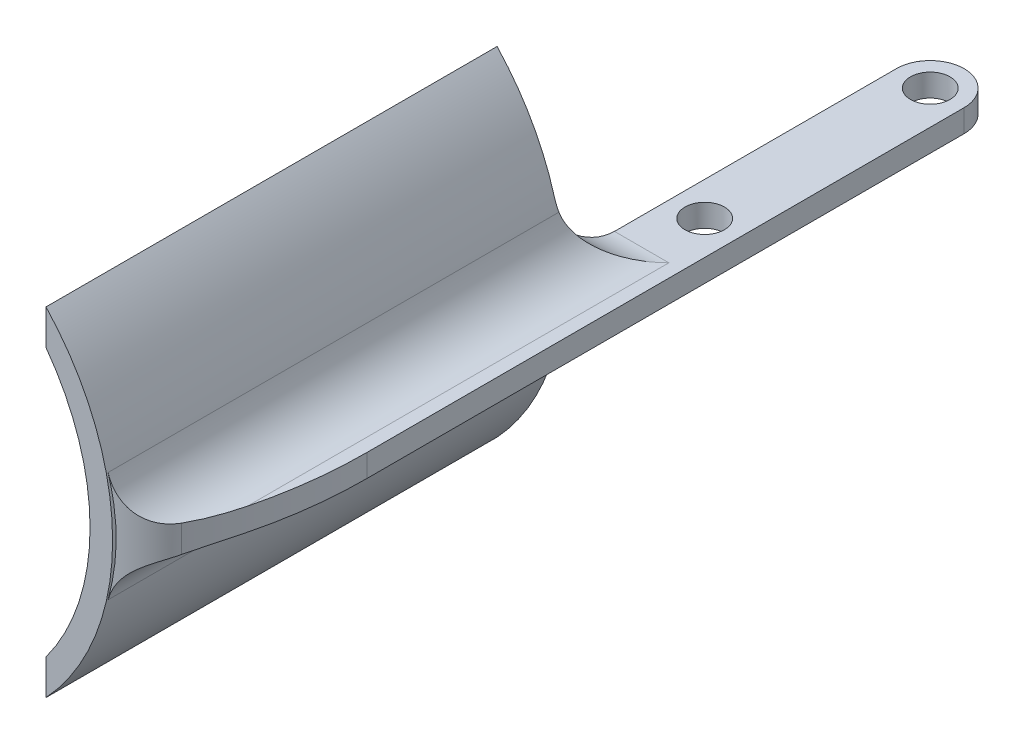
ISO-10303-21;
HEADER;
FILE_DESCRIPTION(('STEP AP214'),'2;1');
FILE_NAME('part.step','',(''),(''),'','','');
FILE_SCHEMA(('AUTOMOTIVE_DESIGN { 1 0 10303 214 1 1 1 1 }'));
ENDSEC;
DATA;
#1=APPLICATION_CONTEXT('core data for automotive mechanical design processes');
#2=APPLICATION_PROTOCOL_DEFINITION('international standard','automotive_design',2000,#1);
#3=PRODUCT_CONTEXT('',#1,'mechanical');
#4=PRODUCT('Part','Part','',(#3));
#5=PRODUCT_RELATED_PRODUCT_CATEGORY('part','',(#4));
#6=PRODUCT_DEFINITION_FORMATION('','',#4);
#7=PRODUCT_DEFINITION_CONTEXT('part definition',#1,'design');
#8=PRODUCT_DEFINITION('design','',#6,#7);
#9=PRODUCT_DEFINITION_SHAPE('','',#8);
#10=(LENGTH_UNIT() NAMED_UNIT(*) SI_UNIT(.MILLI.,.METRE.));
#11=(NAMED_UNIT(*) PLANE_ANGLE_UNIT() SI_UNIT($,.RADIAN.));
#12=(NAMED_UNIT(*) SI_UNIT($,.STERADIAN.) SOLID_ANGLE_UNIT());
#13=UNCERTAINTY_MEASURE_WITH_UNIT(LENGTH_MEASURE(1.E-05),#10,'distance_accuracy_value','');
#14=(GEOMETRIC_REPRESENTATION_CONTEXT(3) GLOBAL_UNCERTAINTY_ASSIGNED_CONTEXT((#13)) GLOBAL_UNIT_ASSIGNED_CONTEXT((#10,
#11,#12)) REPRESENTATION_CONTEXT('',''));
#15=CARTESIAN_POINT('',(0.,0.,0.));
#16=DIRECTION('',(0.,0.,1.));
#17=DIRECTION('',(1.,0.,0.));
#18=AXIS2_PLACEMENT_3D('',#15,#16,#17);
#19=CARTESIAN_POINT('',(-30.8214285714286,2.,-17.0461558297297));
#20=DIRECTION('',(0.,-1.,0.));
#21=DIRECTION('',(0.,0.,-1.));
#22=AXIS2_PLACEMENT_3D('',#19,#20,#21);
#23=CYLINDRICAL_SURFACE('',#22,38.3214285714286);
#24=CARTESIAN_POINT('',(-30.8214285714286,2.,-17.0461558297297));
#25=DIRECTION('',(0.,1.,0.));
#26=DIRECTION('',(0.,0.,-1.));
#27=AXIS2_PLACEMENT_3D('',#24,#25,#26);
#28=CIRCLE('',#27,38.3214285714286);
#29=CARTESIAN_POINT('',(6.32489316217637,2.,-7.62900820326596));
#30=VERTEX_POINT('',#29);
#31=CARTESIAN_POINT('',(7.5,2.,-17.0461558297297));
#32=VERTEX_POINT('',#31);
#33=EDGE_CURVE('E209',#30,#32,#28,.T.);
#34=ORIENTED_EDGE('',*,*,#33,.F.);
#35=CARTESIAN_POINT('',(6.32489316217636,2.,-7.62900820326596));
#36=CARTESIAN_POINT('',(6.27707327635392,2.00000235625704,-7.44038034578845));
#37=CARTESIAN_POINT('',(6.2278169274933,2.00068571798965,-7.25211890833999));
#38=CARTESIAN_POINT('',(6.12644428756139,2.00368199035217,-6.87637483605984));
#39=CARTESIAN_POINT('',(6.07432790904078,2.00599495083492,-6.6888922252306));
#40=CARTESIAN_POINT('',(5.91389117146253,2.01576864076235,-6.12832234970799));
#41=CARTESIAN_POINT('',(5.80132370903215,2.02606241366789,-5.75648398435544));
#42=CARTESIAN_POINT('',(5.56504093643033,2.05663811454083,-5.01671352206102));
#43=CARTESIAN_POINT('',(5.44132466233196,2.07692090683769,-4.64878176596497));
#44=CARTESIAN_POINT('',(5.24754639616546,2.11700137547345,-4.10016642924162));
#45=CARTESIAN_POINT('',(5.18152865325315,2.13198722007853,-3.91769298583726));
#46=CARTESIAN_POINT('',(5.04683840026124,2.16560438238466,-3.55404986794203));
#47=CARTESIAN_POINT('',(4.97816566186703,2.18423601416485,-3.37288030717383));
#48=CARTESIAN_POINT('',(4.90819776168529,2.20490102894346,-3.19243106520669));
#49=B_SPLINE_CURVE_WITH_KNOTS('',3,(#35,#36,#37,#38,#39,#40,#41,#42,#43,#44,#45,#46,#47,#48),
.UNSPECIFIED.,.F.,.F.,(4,2,2,2,2,2,4),(0.,0.583772582110879,1.16756302382368,2.33319812881794,
3.49893411156505,4.08276319124045,4.66664258908381),.UNSPECIFIED.);
#50=CARTESIAN_POINT('',(4.9081977616853,2.20490102894346,-3.19243106520669));
#51=VERTEX_POINT('',#50);
#52=EDGE_CURVE('E300',#30,#51,#49,.T.);
#53=ORIENTED_EDGE('',*,*,#52,.T.);
#54=DIRECTION('',(0.,-1.,0.));
#55=VECTOR('',#54,1.);
#56=CARTESIAN_POINT('',(4.9081977616853,2.,-3.19243106520669));
#57=LINE('',#56,#55);
#58=CARTESIAN_POINT('',(4.9081977616853,-0.20490102894346,-3.19243106520669));
#59=VERTEX_POINT('',#58);
#60=EDGE_CURVE('E246',#51,#59,#57,.T.);
#61=ORIENTED_EDGE('',*,*,#60,.T.);
#62=CARTESIAN_POINT('',(4.9081977616853,-0.20490102894346,-3.19243106520669));
#63=CARTESIAN_POINT('',(4.97816566186703,-0.184236014164849,-3.37288030717383));
#64=CARTESIAN_POINT('',(5.04683840026124,-0.165604382384656,-3.55404986794203));
#65=CARTESIAN_POINT('',(5.18152865325315,-0.131987220078529,-3.91769298583726));
#66=CARTESIAN_POINT('',(5.24754639616546,-0.11700137547345,-4.10016642924162));
#67=CARTESIAN_POINT('',(5.44132466233196,-0.0769209068376889,-4.64878176596497));
#68=CARTESIAN_POINT('',(5.56504093643033,-0.0566381145408316,-5.01671352206102));
#69=CARTESIAN_POINT('',(5.80132370903214,-0.0260624136678938,-5.75648398435544));
#70=CARTESIAN_POINT('',(5.91389117146254,-0.0157686407623454,-6.12832234970799));
#71=CARTESIAN_POINT('',(6.07432790904078,-0.0059949508349247,-6.6888922252306));
#72=CARTESIAN_POINT('',(6.1264442875614,-0.00368199035217468,-6.87637483605984));
#73=CARTESIAN_POINT('',(6.2278169274933,-0.000685717989651057,-7.25211890833999));
#74=CARTESIAN_POINT('',(6.27707327635392,-2.35625703727614E-06,-7.44038034578845));
#75=CARTESIAN_POINT('',(6.32489316217637,0.,-7.62900820326596));
#76=B_SPLINE_CURVE_WITH_KNOTS('',3,(#62,#63,#64,#65,#66,#67,#68,#69,#70,#71,#72,#73,#74,#75),
.UNSPECIFIED.,.F.,.F.,(4,2,2,2,2,2,4),(0.,0.58387939784336,1.16770847751876,2.33344446026587,
3.49907956526013,4.08287000697293,4.66664258908381),.UNSPECIFIED.);
#77=CARTESIAN_POINT('',(6.32489316217637,0.,-7.62900820326596));
#78=VERTEX_POINT('',#77);
#79=EDGE_CURVE('E375',#59,#78,#76,.T.);
#80=ORIENTED_EDGE('',*,*,#79,.T.);
#81=CARTESIAN_POINT('',(-30.8214285714286,0.,-17.0461558297297));
#82=DIRECTION('',(0.,1.,0.));
#83=DIRECTION('',(0.,0.,-1.));
#84=AXIS2_PLACEMENT_3D('',#81,#82,#83);
#85=CIRCLE('',#84,38.3214285714286);
#86=CARTESIAN_POINT('',(7.5,0.,-17.0461558297297));
#87=VERTEX_POINT('',#86);
#88=EDGE_CURVE('E208',#78,#87,#85,.T.);
#89=ORIENTED_EDGE('',*,*,#88,.T.);
#90=DIRECTION('',(0.,-1.,0.));
#91=VECTOR('',#90,1.);
#92=CARTESIAN_POINT('',(7.5,2.,-17.0461558297297));
#93=LINE('',#92,#91);
#94=EDGE_CURVE('E236',#32,#87,#93,.T.);
#95=ORIENTED_EDGE('',*,*,#94,.F.);
#96=EDGE_LOOP('',(#34,#53,#61,#80,#89,#95));
#97=FACE_BOUND('',#96,.T.);
#98=ADVANCED_FACE('F34',(#97),#23,.T.);
#99=CARTESIAN_POINT('',(7.49999999999999,2.,-70.));
#100=DIRECTION('',(-1.,0.,0.));
#101=DIRECTION('',(0.,0.,1.));
#102=AXIS2_PLACEMENT_3D('',#99,#100,#101);
#103=PLANE('',#102);
#104=DIRECTION('',(0.,0.,-1.));
#105=VECTOR('',#104,1.);
#106=CARTESIAN_POINT('',(7.49999999999999,0.,-70.));
#107=LINE('',#106,#105);
#108=CARTESIAN_POINT('',(7.49999999999999,0.,-70.));
#109=VERTEX_POINT('',#108);
#110=EDGE_CURVE('E221',#87,#109,#107,.T.);
#111=ORIENTED_EDGE('',*,*,#110,.T.);
#112=DIRECTION('',(0.,-1.,0.));
#113=VECTOR('',#112,1.);
#114=CARTESIAN_POINT('',(7.49999999999999,2.,-70.));
#115=LINE('',#114,#113);
#116=CARTESIAN_POINT('',(7.49999999999999,2.,-70.));
#117=VERTEX_POINT('',#116);
#118=EDGE_CURVE('E233',#117,#109,#115,.T.);
#119=ORIENTED_EDGE('',*,*,#118,.F.);
#120=DIRECTION('',(0.,0.,-1.));
#121=VECTOR('',#120,1.);
#122=CARTESIAN_POINT('',(7.49999999999999,2.,-70.));
#123=LINE('',#122,#121);
#124=EDGE_CURVE('E211',#32,#117,#123,.T.);
#125=ORIENTED_EDGE('',*,*,#124,.F.);
#126=ORIENTED_EDGE('',*,*,#94,.T.);
#127=EDGE_LOOP('',(#111,#119,#125,#126));
#128=FACE_BOUND('',#127,.T.);
#129=ADVANCED_FACE('F371',(#128),#103,.F.);
#130=CARTESIAN_POINT('',(4.49999999999999,2.,-70.));
#131=DIRECTION('',(0.,-1.,0.));
#132=DIRECTION('',(0.,0.,-1.));
#133=AXIS2_PLACEMENT_3D('',#130,#131,#132);
#134=CYLINDRICAL_SURFACE('',#133,3.);
#135=CARTESIAN_POINT('',(4.49999999999999,0.,-70.));
#136=DIRECTION('',(0.,1.,0.));
#137=DIRECTION('',(0.,0.,-1.));
#138=AXIS2_PLACEMENT_3D('',#135,#136,#137);
#139=CIRCLE('',#138,3.);
#140=CARTESIAN_POINT('',(1.49999999999999,0.,-70.));
#141=VERTEX_POINT('',#140);
#142=EDGE_CURVE('E223',#109,#141,#139,.T.);
#143=ORIENTED_EDGE('',*,*,#142,.T.);
#144=DIRECTION('',(0.,-1.,0.));
#145=VECTOR('',#144,1.);
#146=CARTESIAN_POINT('',(1.49999999999999,2.,-70.));
#147=LINE('',#146,#145);
#148=CARTESIAN_POINT('',(1.49999999999999,2.,-70.));
#149=VERTEX_POINT('',#148);
#150=EDGE_CURVE('E230',#149,#141,#147,.T.);
#151=ORIENTED_EDGE('',*,*,#150,.F.);
#152=CARTESIAN_POINT('',(4.49999999999999,2.,-70.));
#153=DIRECTION('',(0.,1.,0.));
#154=DIRECTION('',(0.,0.,-1.));
#155=AXIS2_PLACEMENT_3D('',#152,#153,#154);
#156=CIRCLE('',#155,3.);
#157=EDGE_CURVE('E214',#117,#149,#156,.T.);
#158=ORIENTED_EDGE('',*,*,#157,.F.);
#159=ORIENTED_EDGE('',*,*,#118,.T.);
#160=EDGE_LOOP('',(#143,#151,#158,#159));
#161=FACE_BOUND('',#160,.T.);
#162=ADVANCED_FACE('F407',(#161),#134,.T.);
#163=CARTESIAN_POINT('',(1.49999999999999,2.,-40.));
#164=DIRECTION('',(1.,0.,0.));
#165=DIRECTION('',(0.,0.,-1.));
#166=AXIS2_PLACEMENT_3D('',#163,#164,#165);
#167=PLANE('',#166);
#168=DIRECTION('',(0.,0.,1.));
#169=VECTOR('',#168,1.);
#170=CARTESIAN_POINT('',(1.49999999999999,0.,-40.));
#171=LINE('',#170,#169);
#172=CARTESIAN_POINT('',(1.49999999999999,0.,-45.2678268764264));
#173=VERTEX_POINT('',#172);
#174=EDGE_CURVE('E212',#141,#173,#171,.T.);
#175=ORIENTED_EDGE('',*,*,#174,.T.);
#176=DIRECTION('',(0.,1.,0.));
#177=VECTOR('',#176,1.);
#178=CARTESIAN_POINT('',(1.49999999999999,2.,-45.2678268764264));
#179=LINE('',#178,#177);
#180=CARTESIAN_POINT('',(1.49999999999999,2.,-45.2678268764264));
#181=VERTEX_POINT('',#180);
#182=EDGE_CURVE('E239',#173,#181,#179,.T.);
#183=ORIENTED_EDGE('',*,*,#182,.T.);
#184=DIRECTION('',(0.,0.,1.));
#185=VECTOR('',#184,1.);
#186=CARTESIAN_POINT('',(1.49999999999999,2.,-40.));
#187=LINE('',#186,#185);
#188=EDGE_CURVE('E216',#149,#181,#187,.T.);
#189=ORIENTED_EDGE('',*,*,#188,.F.);
#190=ORIENTED_EDGE('',*,*,#150,.T.);
#191=EDGE_LOOP('',(#175,#183,#189,#190));
#192=FACE_BOUND('',#191,.T.);
#193=ADVANCED_FACE('F411',(#192),#167,.F.);
#194=CARTESIAN_POINT('',(4.49999999999999,2.,-70.));
#195=DIRECTION('',(0.,-1.,0.));
#196=DIRECTION('',(0.,0.,-1.));
#197=AXIS2_PLACEMENT_3D('',#194,#195,#196);
#198=PLANE('',#197);
#199=CARTESIAN_POINT('',(4.49999999999999,2.,-70.));
#200=DIRECTION('',(0.,-1.,0.));
#201=DIRECTION('',(0.,0.,-1.));
#202=AXIS2_PLACEMENT_3D('',#199,#200,#201);
#203=CIRCLE('',#202,1.75);
#204=CARTESIAN_POINT('',(4.49999999999999,2.,-71.75));
#205=VERTEX_POINT('',#204);
#206=EDGE_CURVE('E205',#205,#205,#203,.T.);
#207=ORIENTED_EDGE('',*,*,#206,.T.);
#208=EDGE_LOOP('',(#207));
#209=FACE_BOUND('',#208,.T.);
#210=CARTESIAN_POINT('',(4.5,2.,-50.));
#211=DIRECTION('',(0.,-1.,0.));
#212=DIRECTION('',(0.,0.,-1.));
#213=AXIS2_PLACEMENT_3D('',#210,#211,#212);
#214=CIRCLE('',#213,1.75);
#215=CARTESIAN_POINT('',(4.5,2.,-51.75));
#216=VERTEX_POINT('',#215);
#217=EDGE_CURVE('E200',#216,#216,#214,.T.);
#218=ORIENTED_EDGE('',*,*,#217,.T.);
#219=EDGE_LOOP('',(#218));
#220=FACE_BOUND('',#219,.T.);
#221=CARTESIAN_POINT('',(-8.50000000000001,2.,-45.2678268764264));
#222=DIRECTION('',(0.,-1.,0.));
#223=DIRECTION('',(0.,0.,-1.));
#224=AXIS2_PLACEMENT_3D('',#221,#222,#223);
#225=CIRCLE('',#224,10.);
#226=CARTESIAN_POINT('',(1.49641279481112,2.,-45.));
#227=VERTEX_POINT('',#226);
#228=EDGE_CURVE('E243',#181,#227,#225,.T.);
#229=ORIENTED_EDGE('',*,*,#228,.T.);
#230=DIRECTION('',(-1.,0.,0.));
#231=VECTOR('',#230,1.);
#232=CARTESIAN_POINT('',(6.32489316217636,2.,-45.));
#233=LINE('',#232,#231);
#234=CARTESIAN_POINT('',(6.32489316217636,2.,-45.));
#235=VERTEX_POINT('',#234);
#236=EDGE_CURVE('E322',#227,#235,#233,.F.);
#237=ORIENTED_EDGE('',*,*,#236,.T.);
#238=DIRECTION('',(0.,0.,1.));
#239=VECTOR('',#238,1.);
#240=CARTESIAN_POINT('',(6.32489316217636,2.,-70.));
#241=LINE('',#240,#239);
#242=EDGE_CURVE('E388',#235,#30,#241,.T.);
#243=ORIENTED_EDGE('',*,*,#242,.T.);
#244=ORIENTED_EDGE('',*,*,#33,.T.);
#245=ORIENTED_EDGE('',*,*,#124,.T.);
#246=ORIENTED_EDGE('',*,*,#157,.T.);
#247=ORIENTED_EDGE('',*,*,#188,.T.);
#248=EDGE_LOOP('',(#229,#237,#243,#244,#245,#246,#247));
#249=FACE_BOUND('',#248,.T.);
#250=ADVANCED_FACE('F396',(#209,#220,#249),#198,.F.);
#251=CARTESIAN_POINT('',(4.49999999999999,0.,-70.));
#252=DIRECTION('',(0.,-1.,0.));
#253=DIRECTION('',(0.,0.,-1.));
#254=AXIS2_PLACEMENT_3D('',#251,#252,#253);
#255=PLANE('',#254);
#256=DIRECTION('',(0.,0.,-1.));
#257=VECTOR('',#256,1.);
#258=CARTESIAN_POINT('',(6.32489316217636,0.,-40.));
#259=LINE('',#258,#257);
#260=CARTESIAN_POINT('',(6.32489316217636,0.,-45.));
#261=VERTEX_POINT('',#260);
#262=EDGE_CURVE('E390',#78,#261,#259,.T.);
#263=ORIENTED_EDGE('',*,*,#262,.T.);
#264=DIRECTION('',(-1.,0.,0.));
#265=VECTOR('',#264,1.);
#266=CARTESIAN_POINT('',(4.49999999999999,0.,-45.));
#267=LINE('',#266,#265);
#268=CARTESIAN_POINT('',(1.49641279481112,0.,-45.));
#269=VERTEX_POINT('',#268);
#270=EDGE_CURVE('E315',#261,#269,#267,.T.);
#271=ORIENTED_EDGE('',*,*,#270,.T.);
#272=CARTESIAN_POINT('',(-8.50000000000001,0.,-45.2678268764264));
#273=DIRECTION('',(0.,-1.,0.));
#274=DIRECTION('',(0.,0.,-1.));
#275=AXIS2_PLACEMENT_3D('',#272,#273,#274);
#276=CIRCLE('',#275,10.);
#277=EDGE_CURVE('E241',#269,#173,#276,.F.);
#278=ORIENTED_EDGE('',*,*,#277,.T.);
#279=ORIENTED_EDGE('',*,*,#174,.F.);
#280=ORIENTED_EDGE('',*,*,#142,.F.);
#281=ORIENTED_EDGE('',*,*,#110,.F.);
#282=ORIENTED_EDGE('',*,*,#88,.F.);
#283=EDGE_LOOP('',(#263,#271,#278,#279,#280,#281,#282));
#284=FACE_BOUND('',#283,.T.);
#285=CARTESIAN_POINT('',(4.49999999999999,0.,-70.));
#286=DIRECTION('',(0.,1.,0.));
#287=DIRECTION('',(0.,0.,1.));
#288=AXIS2_PLACEMENT_3D('',#285,#286,#287);
#289=CIRCLE('',#288,1.75);
#290=CARTESIAN_POINT('',(4.49999999999999,0.,-68.25));
#291=VERTEX_POINT('',#290);
#292=EDGE_CURVE('E197',#291,#291,#289,.T.);
#293=ORIENTED_EDGE('',*,*,#292,.T.);
#294=EDGE_LOOP('',(#293));
#295=FACE_BOUND('',#294,.T.);
#296=CARTESIAN_POINT('',(4.5,0.,-50.));
#297=DIRECTION('',(0.,1.,0.));
#298=DIRECTION('',(0.,0.,1.));
#299=AXIS2_PLACEMENT_3D('',#296,#297,#298);
#300=CIRCLE('',#299,1.75);
#301=CARTESIAN_POINT('',(4.5,0.,-48.25));
#302=VERTEX_POINT('',#301);
#303=EDGE_CURVE('E192',#302,#302,#300,.T.);
#304=ORIENTED_EDGE('',*,*,#303,.T.);
#305=EDGE_LOOP('',(#304));
#306=FACE_BOUND('',#305,.T.);
#307=ADVANCED_FACE('F365',(#284,#295,#306),#255,.T.);
#308=CARTESIAN_POINT('',(-8.50000000000001,2.,-45.2678268764264));
#309=DIRECTION('',(0.,1.,0.));
#310=DIRECTION('',(0.,0.,1.));
#311=AXIS2_PLACEMENT_3D('',#308,#309,#310);
#312=CYLINDRICAL_SURFACE('',#311,10.);
#313=ORIENTED_EDGE('',*,*,#228,.F.);
#314=ORIENTED_EDGE('',*,*,#182,.F.);
#315=ORIENTED_EDGE('',*,*,#277,.F.);
#316=CARTESIAN_POINT('',(1.49641279481112,0.,-45.));
#317=CARTESIAN_POINT('',(1.49287519432976,2.2430243795173E-05,-44.8670429848361));
#318=CARTESIAN_POINT('',(1.4866371610133,-0.00530217517071067,-44.7341733567804));
#319=CARTESIAN_POINT('',(1.46897108711546,-0.0264408943517034,-44.4696772682441));
#320=CARTESIAN_POINT('',(1.45754540165065,-0.0422502496971525,-44.3380502712775));
#321=CARTESIAN_POINT('',(1.42977776273164,-0.0840541860501793,-44.0776088139234));
#322=CARTESIAN_POINT('',(1.41345954929194,-0.109999763252416,-43.9487839235138));
#323=CARTESIAN_POINT('',(1.37624525429644,-0.171747383921411,-43.6941922139222));
#324=CARTESIAN_POINT('',(1.35534882010999,-0.207550186680899,-43.5684256311313));
#325=CARTESIAN_POINT('',(1.30946121935236,-0.28855063067089,-43.3209634350871));
#326=CARTESIAN_POINT('',(1.28447691662806,-0.33373255722882,-43.1992614026833));
#327=CARTESIAN_POINT('',(1.23091556998946,-0.43308432923872,-42.9603831962769));
#328=CARTESIAN_POINT('',(1.20233717330987,-0.4872575613565,-42.8432087482142));
#329=CARTESIAN_POINT('',(1.11203207149931,-0.662657100042663,-42.4992715494778));
#330=CARTESIAN_POINT('',(1.04573963847538,-0.796756052729763,-42.280116684918));
#331=CARTESIAN_POINT('',(0.901658000391102,-1.10531617338325,-41.8526982942335));
#332=CARTESIAN_POINT('',(0.82339896090372,-1.28185560680775,-41.6461055912304));
#333=CARTESIAN_POINT('',(0.665866236014294,-1.66582737275344,-41.2641253844953));
#334=CARTESIAN_POINT('',(0.586591707250554,-1.87328714103489,-41.0887659005836));
#335=CARTESIAN_POINT('',(0.428601581965043,-2.33307268835162,-40.7605190518467));
#336=CARTESIAN_POINT('',(0.350413615013548,-2.58763749598878,-40.6104580531392));
#337=CARTESIAN_POINT('',(0.246624077923271,-2.9887362227668,-40.4199612038141));
#338=CARTESIAN_POINT('',(0.214289533564789,-3.12556869798818,-40.3622489356111));
#339=CARTESIAN_POINT('',(0.155317819095125,-3.40488058405533,-40.2589335544085));
#340=CARTESIAN_POINT('',(0.128676451860196,-3.54735574250949,-40.2133215148481));
#341=CARTESIAN_POINT('',(0.0885436769000554,-3.79751134964835,-40.1455210282507));
#342=CARTESIAN_POINT('',(0.0734458902095637,-3.90413510719394,-40.1203352826755));
#343=CARTESIAN_POINT('',(0.0472524572542505,-4.11926436359135,-40.0769584404347));
#344=CARTESIAN_POINT('',(0.0361557307207826,-4.22776934621589,-40.0587654556669));
#345=CARTESIAN_POINT('',(0.0182297875572466,-4.44652081685573,-40.0294994015281));
#346=CARTESIAN_POINT('',(0.0114173938102405,-4.55677244860371,-40.0184543945771));
#347=CARTESIAN_POINT('',(0.00229004417256983,-4.77801233837452,-40.0036956984203));
#348=CARTESIAN_POINT('',(-2.2339975973852E-05,-4.88900098126555,-39.9999862014171));
#349=CARTESIAN_POINT('',(0.,-5.,-40.));
#350=B_SPLINE_CURVE_WITH_KNOTS('',3,(#316,#317,#318,#319,#320,#321,#322,#323,#324,#325,#326,
#327,#328,#329,#330,#331,#332,#333,#334,#335,#336,#337,#338,#339,#340,#341,#342,#343,#344,#345,
#346,#347,#348,#349),.UNSPECIFIED.,.F.,.F.,(4,2,2,2,2,2,2,2,2,2,2,2,2,2,2,2,4),(0.,
0.398855460097247,0.797530026551763,1.19430057907306,1.59110170300845,1.98724327862208,
2.38353440498653,3.17618570373247,4.02109934144923,4.86676718813979,5.77850999875875,
6.23391090144645,6.68897490635695,7.02047524162459,7.35188600611889,7.68459009564124,
8.01748426878891),.UNSPECIFIED.);
#351=CARTESIAN_POINT('',(0.,-5.,-40.));
#352=VERTEX_POINT('',#351);
#353=EDGE_CURVE('E279',#269,#352,#350,.T.);
#354=ORIENTED_EDGE('',*,*,#353,.T.);
#355=DIRECTION('',(0.,-1.,0.));
#356=VECTOR('',#355,1.);
#357=CARTESIAN_POINT('',(0.,2.,-40.));
#358=LINE('',#357,#356);
#359=CARTESIAN_POINT('',(0.,0.999999999999996,-40.));
#360=VERTEX_POINT('',#359);
#361=EDGE_CURVE('E219',#360,#352,#358,.T.);
#362=ORIENTED_EDGE('',*,*,#361,.F.);
#363=CARTESIAN_POINT('',(0.,7.,-40.));
#364=VERTEX_POINT('',#363);
#365=EDGE_CURVE('E227',#364,#360,#358,.T.);
#366=ORIENTED_EDGE('',*,*,#365,.F.);
#367=CARTESIAN_POINT('',(0.,7.,-40.));
#368=CARTESIAN_POINT('',(-4.04969519979059E-05,6.87035096358478,-39.9999753454954));
#369=CARTESIAN_POINT('',(0.0031241054852976,6.74072495271426,-40.0050417687705));
#370=CARTESIAN_POINT('',(0.0155578172628042,6.48263072409748,-40.0251626620136));
#371=CARTESIAN_POINT('',(0.0248227812605807,6.35416178014563,-40.0402103495238));
#372=CARTESIAN_POINT('',(0.0490756042665624,6.10011790281596,-40.0799744101121));
#373=CARTESIAN_POINT('',(0.0640270182377793,5.9745298310673,-40.104629234279));
#374=CARTESIAN_POINT('',(0.0991059588192331,5.72631044000009,-40.163265929354));
#375=CARTESIAN_POINT('',(0.119234155164554,5.60367950550175,-40.1972490071232));
#376=CARTESIAN_POINT('',(0.186315614468234,5.24199263001037,-40.3124406919508));
#377=CARTESIAN_POINT('',(0.240052600985219,5.00830649293673,-40.4070257454809));
#378=CARTESIAN_POINT('',(0.359643145049365,4.56000898795217,-40.6285906708255));
#379=CARTESIAN_POINT('',(0.425517513281936,4.34543133520207,-40.7556263290592));
#380=CARTESIAN_POINT('',(0.569408906241453,3.92033653255834,-41.0517501686587));
#381=CARTESIAN_POINT('',(0.647985240466163,3.7119311847058,-41.2235978006453));
#382=CARTESIAN_POINT('',(0.804795017787624,3.3252041853104,-41.5987621897205));
#383=CARTESIAN_POINT('',(0.883028317209547,3.1468941479885,-41.8020910380969));
#384=CARTESIAN_POINT('',(0.998053428510529,2.89825206383604,-42.1369230603493));
#385=CARTESIAN_POINT('',(1.03743350580637,2.81583507902582,-42.2587417585781));
#386=CARTESIAN_POINT('',(1.113053863059,2.66169330299354,-42.5098647808016));
#387=CARTESIAN_POINT('',(1.14929545110152,2.58996404818023,-42.6391659483387));
#388=CARTESIAN_POINT('',(1.21765265238878,2.45794927498343,-42.9043618886671));
#389=CARTESIAN_POINT('',(1.24977221090873,2.39765278727391,-43.0402501825087));
#390=CARTESIAN_POINT('',(1.30903950733603,2.28914396843287,-43.3177386485706));
#391=CARTESIAN_POINT('',(1.33619043004642,2.24092388919067,-43.4593350904349));
#392=CARTESIAN_POINT('',(1.37943596618414,2.1663951443041,-43.7155003814643));
#393=CARTESIAN_POINT('',(1.39664891439828,2.13759985984824,-43.8291640735114));
#394=CARTESIAN_POINT('',(1.42730722658612,2.08799971973941,-44.0587051486065));
#395=CARTESIAN_POINT('',(1.44075343694654,2.06719306864898,-44.1745820280897));
#396=CARTESIAN_POINT('',(1.46367993137917,2.03373521799476,-44.4082449856558));
#397=CARTESIAN_POINT('',(1.4731485587421,2.02110793108061,-44.5260356388602));
#398=CARTESIAN_POINT('',(1.48793274811086,2.00423123804435,-44.7625282447222));
#399=CARTESIAN_POINT('',(1.49324638523381,1.99998571355539,-44.8812305940577));
#400=CARTESIAN_POINT('',(1.49641279481112,2.,-45.));
#401=B_SPLINE_CURVE_WITH_KNOTS('',3,(#367,#368,#369,#370,#371,#372,#373,#374,#375,#376,#377,
#378,#379,#380,#381,#382,#383,#384,#385,#386,#387,#388,#389,#390,#391,#392,#393,#394,#395,#396,
#397,#398,#399,#400),.UNSPECIFIED.,.F.,.F.,(4,2,2,2,2,2,2,2,2,2,2,2,2,2,2,2,4),(0.,
0.388771918818526,0.777279930030779,1.16333880581285,1.54944765227733,2.31914390736504,
3.09017237224536,3.93074277894461,4.77163683601707,5.22791962833386,5.68401132271752,
6.13966317438825,6.59502193081884,6.95022810461387,7.3053543993764,7.66151428727304,
8.01783907581518),.UNSPECIFIED.);
#402=EDGE_CURVE('E357',#364,#227,#401,.T.);
#403=ORIENTED_EDGE('',*,*,#402,.T.);
#404=EDGE_LOOP('',(#313,#314,#315,#354,#362,#366,#403));
#405=FACE_BOUND('',#404,.T.);
#406=ADVANCED_FACE('F334',(#405),#312,.F.);
#407=CARTESIAN_POINT('',(0.246363943758047,2.,-5.));
#408=DIRECTION('',(0.,-1.,0.));
#409=DIRECTION('',(0.,0.,-1.));
#410=AXIS2_PLACEMENT_3D('',#407,#408,#409);
#411=CYLINDRICAL_SURFACE('',#410,5.);
#412=CARTESIAN_POINT('',(1.44991294695854,-3.88888888888879,-0.147014341985425));
#413=CARTESIAN_POINT('',(1.48629753336148,-3.72925131120723,-0.156040039431146));
#414=CARTESIAN_POINT('',(1.52089922085758,-3.56921236419807,-0.165053080802758));
#415=CARTESIAN_POINT('',(1.5865240489225,-3.24838702793276,-0.182829635499399));
#416=CARTESIAN_POINT('',(1.61754715347023,-3.08760063116992,-0.19159314631205));
#417=CARTESIAN_POINT('',(1.70523844978726,-2.60415277096642,-0.217175701729085));
#418=CARTESIAN_POINT('',(1.75651613343636,-2.28045743968974,-0.233283519155425));
#419=CARTESIAN_POINT('',(1.84451524808779,-1.63140036061764,-0.262062389699761));
#420=CARTESIAN_POINT('',(1.88125645288229,-1.3060414906067,-0.27473810400012));
#421=CARTESIAN_POINT('',(1.94018520875422,-0.653914405826978,-0.295539490897071));
#422=CARTESIAN_POINT('',(1.96237533452926,-0.327146450689875,-0.30366596840765));
#423=CARTESIAN_POINT('',(1.99241622826613,0.333071779691516,-0.314750193501693));
#424=CARTESIAN_POINT('',(2.,0.666535889845758,-0.317611658325618));
#425=CARTESIAN_POINT('',(2.,1.33346411015424,-0.317611658325617));
#426=CARTESIAN_POINT('',(1.99241622826613,1.66692822030848,-0.314750193501692));
#427=CARTESIAN_POINT('',(1.96237533452926,2.32714645068988,-0.303665968407649));
#428=CARTESIAN_POINT('',(1.94018520875421,2.65391440582699,-0.29553949089707));
#429=CARTESIAN_POINT('',(1.88125645288228,3.30604149060673,-0.274738104000118));
#430=CARTESIAN_POINT('',(1.84451524808778,3.63140036061768,-0.262062389699757));
#431=CARTESIAN_POINT('',(1.75651613343635,4.2804574396898,-0.23328351915542));
#432=CARTESIAN_POINT('',(1.70523844978725,4.60415277096649,-0.217175701729081));
#433=CARTESIAN_POINT('',(1.61754715347021,5.08760063116999,-0.191593146312045));
#434=CARTESIAN_POINT('',(1.58652404892249,5.24838702793284,-0.182829635499394));
#435=CARTESIAN_POINT('',(1.52089922085757,5.56921236419816,-0.165053080802753));
#436=CARTESIAN_POINT('',(1.48629753336146,5.72925131120731,-0.156040039431141));
#437=CARTESIAN_POINT('',(1.44991294695852,5.88888888888889,-0.147014341985421));
#438=B_SPLINE_CURVE_WITH_KNOTS('',3,(#412,#413,#414,#415,#416,#417,#418,#419,#420,#421,#422,
#423,#424,#425,#426,#427,#428,#429,#430,#431,#432,#433,#434,#435,#436,#437),.UNSPECIFIED.,.F.,
.F.,(4,2,2,2,2,2,2,2,2,2,2,2,4),(0.,0.491918746419227,0.98384244393328,1.96785858985152,
2.95053155037512,3.93303058778916,4.93332480539911,5.93361902300905,6.91611806042313,
7.89879102094674,8.88280716686501,9.37473086437907,9.86664961079831),.UNSPECIFIED.);
#439=CARTESIAN_POINT('',(1.44991294695852,-3.88888888888889,-0.147014341985431));
#440=VERTEX_POINT('',#439);
#441=CARTESIAN_POINT('',(1.44991294695852,5.88888888888889,-0.147014341985425));
#442=VERTEX_POINT('',#441);
#443=EDGE_CURVE('E168',#440,#442,#438,.T.);
#444=ORIENTED_EDGE('',*,*,#443,.F.);
#445=CARTESIAN_POINT('',(1.44991294695852,-3.88888888888889,-0.147014341985431));
#446=CARTESIAN_POINT('',(1.47779979416943,-3.76645766853962,-0.153957979994646));
#447=CARTESIAN_POINT('',(1.51031790677757,-3.64514588306156,-0.162251008714123));
#448=CARTESIAN_POINT('',(1.5842928176347,-3.40551194922098,-0.182169994852142));
#449=CARTESIAN_POINT('',(1.62575291727784,-3.28719092312476,-0.193797183771225));
#450=CARTESIAN_POINT('',(1.71745753039095,-3.05389587685978,-0.221071150857732));
#451=CARTESIAN_POINT('',(1.76773793402886,-2.93893786096303,-0.236734479281647));
#452=CARTESIAN_POINT('',(1.87645420782044,-2.71373268042676,-0.272834916274528));
#453=CARTESIAN_POINT('',(1.9348890971647,-2.60348495132088,-0.293271450928216));
#454=CARTESIAN_POINT('',(2.05949656584404,-2.3881181390206,-0.339851115224437));
#455=CARTESIAN_POINT('',(2.12569797345346,-2.28302035680772,-0.366015839485244));
#456=CARTESIAN_POINT('',(2.26477506467637,-2.07927230412597,-0.424880906013721));
#457=CARTESIAN_POINT('',(2.3376499724023,-1.9806212864103,-0.457580489034154));
#458=CARTESIAN_POINT('',(2.48877254206168,-1.79081717760843,-0.530256011047619));
#459=CARTESIAN_POINT('',(2.5670054561904,-1.69964491192261,-0.570212440338534));
#460=CARTESIAN_POINT('',(2.72767169643102,-1.52522637541408,-0.658169506992673));
#461=CARTESIAN_POINT('',(2.81010454511772,-1.44197920678273,-0.706169231452395));
#462=CARTESIAN_POINT('',(2.9712102970862,-1.28999657954241,-0.806728488586224));
#463=CARTESIAN_POINT('',(3.04968893808641,-1.22063826287053,-0.858658988384251));
#464=CARTESIAN_POINT('',(3.20756274338359,-1.08940069429642,-0.970033562352443));
#465=CARTESIAN_POINT('',(3.28695786585879,-1.02752110258418,-1.02947729489342));
#466=CARTESIAN_POINT('',(3.44530906127942,-0.91127773455185,-1.15591122571027));
#467=CARTESIAN_POINT('',(3.52426493488624,-0.856917139739897,-1.22290459683422));
#468=CARTESIAN_POINT('',(3.68033663823398,-0.755594378754522,-1.36421798414402));
#469=CARTESIAN_POINT('',(3.75745253214428,-0.708631954248604,-1.43853774435647));
#470=CARTESIAN_POINT('',(3.90356504098039,-0.624637459659838,-1.5889681516451));
#471=CARTESIAN_POINT('',(3.97276115480427,-0.587153736342895,-1.66463430889461));
#472=CARTESIAN_POINT('',(4.10752427272307,-0.517922904896117,-1.82161327201057));
#473=CARTESIAN_POINT('',(4.17309110405862,-0.486176069688246,-1.90292634626417));
#474=CARTESIAN_POINT('',(4.29980210302285,-0.427924751497368,-2.07071808237258));
#475=CARTESIAN_POINT('',(4.36094582345825,-0.401420798121028,-2.1571972649312));
#476=CARTESIAN_POINT('',(4.47813094776522,-0.353121251941117,-2.33476675939959));
#477=CARTESIAN_POINT('',(4.53417335603197,-0.33132473112808,-2.4258561580864));
#478=CARTESIAN_POINT('',(4.64884224070819,-0.288825459770862,-2.62650118653662));
#479=CARTESIAN_POINT('',(4.7065333694786,-0.268810305525311,-2.7367375961554));
#480=CARTESIAN_POINT('',(4.81364888283728,-0.233527946197642,-2.96151073715409));
#481=CARTESIAN_POINT('',(4.86309560932131,-0.218247809576546,-3.07603478142962));
#482=CARTESIAN_POINT('',(4.9081977616853,-0.204901028943463,-3.19243106520669));
#483=B_SPLINE_CURVE_WITH_KNOTS('',3,(#445,#446,#447,#448,#449,#450,#451,#452,#453,#454,#455,
#456,#457,#458,#459,#460,#461,#462,#463,#464,#465,#466,#467,#468,#469,#470,#471,#472,#473,#474,
#475,#476,#477,#478,#479,#480,#481,#482),.UNSPECIFIED.,.F.,.F.,(4,2,2,2,2,2,2,2,2,2,2,2,2,2,2,2,
2,2,4),(0.,0.377198159128874,0.754535819470481,1.13344608837733,1.51231082173956,
1.89262921072298,2.27290343838655,2.65217005542689,3.03139365532141,3.38162891834861,
3.73184826178743,4.08221534291863,4.43257018706811,4.75972457619663,5.0868945250022,
5.41409750583284,5.74123592382832,6.118847001254,6.49541752773545),.UNSPECIFIED.);
#484=EDGE_CURVE('E381',#440,#59,#483,.T.);
#485=ORIENTED_EDGE('',*,*,#484,.T.);
#486=ORIENTED_EDGE('',*,*,#60,.F.);
#487=CARTESIAN_POINT('',(4.9081977616853,2.20490102894346,-3.19243106520669));
#488=CARTESIAN_POINT('',(4.86525533172164,2.21760620878614,-3.08162248283867));
#489=CARTESIAN_POINT('',(4.81838568473809,2.23206362105521,-2.97251744871289));
#490=CARTESIAN_POINT('',(4.71727980889243,2.26518669807456,-2.75837498626619));
#491=CARTESIAN_POINT('',(4.66304002413101,2.28385439706481,-2.65333955305333));
#492=CARTESIAN_POINT('',(4.54755348668902,2.32615344442957,-2.44780148125676));
#493=CARTESIAN_POINT('',(4.48628645154719,2.34979933403353,-2.34731319318001));
#494=CARTESIAN_POINT('',(4.35759809541698,2.40276255208911,-2.15194299787719));
#495=CARTESIAN_POINT('',(4.29017782871177,2.43207890993319,-2.05706013480022));
#496=CARTESIAN_POINT('',(4.14974279273154,2.49725237999295,-1.87316821312093));
#497=CARTESIAN_POINT('',(4.07670429009492,2.53313823551141,-1.78418740468433));
#498=CARTESIAN_POINT('',(3.92640152205313,2.61201223285293,-1.61322042024991));
#499=CARTESIAN_POINT('',(3.84913765878836,2.65499969957831,-1.53123358050949));
#500=CARTESIAN_POINT('',(3.69185757739957,2.74847462509652,-1.37497142275514));
#501=CARTESIAN_POINT('',(3.61184873373814,2.7989430389967,-1.30067731352113));
#502=CARTESIAN_POINT('',(3.45032164638409,2.9077736507701,-1.15993111039197));
#503=CARTESIAN_POINT('',(3.36880353314383,2.96613516913382,-1.09347834236466));
#504=CARTESIAN_POINT('',(3.21155582899935,3.08640553331202,-0.972998140630443));
#505=CARTESIAN_POINT('',(3.13582645345587,3.14776777136885,-0.918423358585998));
#506=CARTESIAN_POINT('',(2.98556669257312,3.27726803665568,-0.816098590602483));
#507=CARTESIAN_POINT('',(2.9110362606352,3.34540579980256,-0.768348338846932));
#508=CARTESIAN_POINT('',(2.7642584895704,3.48825152832859,-0.67940045315022));
#509=CARTESIAN_POINT('',(2.69201320705532,3.56296519539326,-0.638208594376502));
#510=CARTESIAN_POINT('',(2.55092056245336,3.71851300060014,-0.562044586527007));
#511=CARTESIAN_POINT('',(2.48207323834239,3.79934720712053,-0.527072506952735));
#512=CARTESIAN_POINT('',(2.34931241433797,3.96586234679895,-0.463152288912095));
#513=CARTESIAN_POINT('',(2.28535894258168,4.05149114118551,-0.434151090886648));
#514=CARTESIAN_POINT('',(2.1624075389257,4.22776847833151,-0.381205762854069));
#515=CARTESIAN_POINT('',(2.10341153562906,4.31841895212722,-0.35726359552493));
#516=CARTESIAN_POINT('',(1.99102329876088,4.50413371504865,-0.313872214863544));
#517=CARTESIAN_POINT('',(1.9376300555662,4.59919720447567,-0.294422191281083));
#518=CARTESIAN_POINT('',(1.83691648686577,4.79318748844413,-0.259432228797729));
#519=CARTESIAN_POINT('',(1.78959744399099,4.89211509320076,-0.243893115063113));
#520=CARTESIAN_POINT('',(1.68244232800271,5.13659011855227,-0.210212057128327));
#521=CARTESIAN_POINT('',(1.62597892473691,5.28388456228516,-0.193826255355477));
#522=CARTESIAN_POINT('',(1.55191094715516,5.50840712480086,-0.173386984152468));
#523=CARTESIAN_POINT('',(1.52901228327383,5.58375948775478,-0.167268287035068));
#524=CARTESIAN_POINT('',(1.48677674399018,5.73555103396606,-0.156257019964866));
#525=CARTESIAN_POINT('',(1.46744014951171,5.81199030243095,-0.151364546707683));
#526=CARTESIAN_POINT('',(1.44991294695852,5.88888888888889,-0.147014341985425));
#527=B_SPLINE_CURVE_WITH_KNOTS('',3,(#487,#488,#489,#490,#491,#492,#493,#494,#495,#496,#497,
#498,#499,#500,#501,#502,#503,#504,#505,#506,#507,#508,#509,#510,#511,#512,#513,#514,#515,#516,
#517,#518,#519,#520,#521,#522,#523,#524,#525,#526),.UNSPECIFIED.,.F.,.F.,(4,2,2,2,2,2,2,2,2,2,2,
2,2,2,2,2,2,2,2,4),(0.,0.358486394364574,0.717146367299543,1.07686888913653,1.4365298920851,
1.7978038442698,2.15904347255208,2.51937877310051,2.87968307246452,3.21438911416845,
3.5490821154668,3.88406822874581,4.21905808501555,4.55092869248106,4.8829278154875,
5.21486700879798,5.54687617964573,6.0217164548099,6.25861317691797,6.49552857397914),.UNSPECIFIED.);
#528=EDGE_CURVE('E308',#51,#442,#527,.T.);
#529=ORIENTED_EDGE('',*,*,#528,.T.);
#530=EDGE_LOOP('',(#444,#485,#486,#529));
#531=FACE_BOUND('',#530,.T.);
#532=ADVANCED_FACE('F254',(#531),#411,.T.);
#533=CARTESIAN_POINT('',(4.5,0.,-50.));
#534=DIRECTION('',(0.,1.,0.));
#535=DIRECTION('',(0.,0.,1.));
#536=AXIS2_PLACEMENT_3D('',#533,#534,#535);
#537=CYLINDRICAL_SURFACE('',#536,1.75);
#538=ORIENTED_EDGE('',*,*,#303,.F.);
#539=EDGE_LOOP('',(#538));
#540=FACE_BOUND('',#539,.T.);
#541=ORIENTED_EDGE('',*,*,#217,.F.);
#542=EDGE_LOOP('',(#541));
#543=FACE_BOUND('',#542,.T.);
#544=ADVANCED_FACE('F434',(#540,#543),#537,.F.);
#545=CARTESIAN_POINT('',(4.49999999999999,0.,-70.));
#546=DIRECTION('',(0.,1.,0.));
#547=DIRECTION('',(0.,0.,1.));
#548=AXIS2_PLACEMENT_3D('',#545,#546,#547);
#549=CYLINDRICAL_SURFACE('',#548,1.75);
#550=ORIENTED_EDGE('',*,*,#292,.F.);
#551=EDGE_LOOP('',(#550));
#552=FACE_BOUND('',#551,.T.);
#553=ORIENTED_EDGE('',*,*,#206,.F.);
#554=EDGE_LOOP('',(#553));
#555=FACE_BOUND('',#554,.T.);
#556=ADVANCED_FACE('F266',(#552,#555),#549,.F.);
#557=CARTESIAN_POINT('',(-20.,0.999999999999996,-40.));
#558=DIRECTION('',(0.,0.,1.));
#559=DIRECTION('',(1.,0.,0.));
#560=AXIS2_PLACEMENT_3D('',#557,#558,#559);
#561=CYLINDRICAL_SURFACE('',#560,20.);
#562=DIRECTION('',(0.,0.,1.));
#563=VECTOR('',#562,1.);
#564=CARTESIAN_POINT('',(-3.90652306056892,12.8743420870379,-40.));
#565=LINE('',#564,#563);
#566=CARTESIAN_POINT('',(-3.90652306056892,12.8743420870379,-40.));
#567=VERTEX_POINT('',#566);
#568=CARTESIAN_POINT('',(-3.90652306056892,12.8743420870379,0.));
#569=VERTEX_POINT('',#568);
#570=EDGE_CURVE('E345',#567,#569,#565,.T.);
#571=ORIENTED_EDGE('',*,*,#570,.F.);
#572=CARTESIAN_POINT('',(-20.,0.999999999999996,-40.));
#573=DIRECTION('',(0.,0.,-1.));
#574=DIRECTION('',(1.,0.,0.));
#575=AXIS2_PLACEMENT_3D('',#572,#573,#574);
#576=CIRCLE('',#575,20.);
#577=EDGE_CURVE('E196',#567,#360,#576,.T.);
#578=ORIENTED_EDGE('',*,*,#577,.T.);
#579=CARTESIAN_POINT('',(-3.90652306056892,-10.8743420870379,-40.));
#580=VERTEX_POINT('',#579);
#581=EDGE_CURVE('E177',#360,#580,#576,.T.);
#582=ORIENTED_EDGE('',*,*,#581,.T.);
#583=DIRECTION('',(0.,0.,1.));
#584=VECTOR('',#583,1.);
#585=CARTESIAN_POINT('',(-3.90652306056892,-10.8743420870379,-40.));
#586=LINE('',#585,#584);
#587=CARTESIAN_POINT('',(-3.90652306056892,-10.8743420870379,0.));
#588=VERTEX_POINT('',#587);
#589=EDGE_CURVE('E159',#588,#580,#586,.F.);
#590=ORIENTED_EDGE('',*,*,#589,.F.);
#591=CARTESIAN_POINT('',(-20.,0.999999999999996,0.));
#592=DIRECTION('',(0.,0.,-1.));
#593=DIRECTION('',(1.,0.,0.));
#594=AXIS2_PLACEMENT_3D('',#591,#592,#593);
#595=CIRCLE('',#594,20.);
#596=EDGE_CURVE('E175',#569,#588,#595,.T.);
#597=ORIENTED_EDGE('',*,*,#596,.F.);
#598=EDGE_LOOP('',(#571,#578,#582,#590,#597));
#599=FACE_BOUND('',#598,.T.);
#600=ADVANCED_FACE('F174',(#599),#561,.F.);
#601=CARTESIAN_POINT('',(-20.,0.999999999999996,-40.));
#602=DIRECTION('',(0.,0.,1.));
#603=DIRECTION('',(1.,0.,0.));
#604=AXIS2_PLACEMENT_3D('',#601,#602,#603);
#605=PLANE('',#604);
#606=CARTESIAN_POINT('',(-20.,0.999999999999996,-40.));
#607=DIRECTION('',(0.,0.,1.));
#608=DIRECTION('',(1.,0.,0.));
#609=AXIS2_PLACEMENT_3D('',#606,#607,#608);
#610=CIRCLE('',#609,22.);
#611=CARTESIAN_POINT('',(1.16601048851672,7.,-40.));
#612=VERTEX_POINT('',#611);
#613=CARTESIAN_POINT('',(-3.90652306056892,16.,-40.));
#614=VERTEX_POINT('',#613);
#615=EDGE_CURVE('E182',#612,#614,#610,.T.);
#616=ORIENTED_EDGE('',*,*,#615,.F.);
#617=DIRECTION('',(-1.,0.,0.));
#618=VECTOR('',#617,1.);
#619=CARTESIAN_POINT('',(0.,7.,-40.));
#620=LINE('',#619,#618);
#621=EDGE_CURVE('E320',#612,#364,#620,.T.);
#622=ORIENTED_EDGE('',*,*,#621,.T.);
#623=ORIENTED_EDGE('',*,*,#365,.T.);
#624=ORIENTED_EDGE('',*,*,#577,.F.);
#625=DIRECTION('',(0.,1.,0.));
#626=VECTOR('',#625,1.);
#627=CARTESIAN_POINT('',(-3.90652306056892,0.999999999999996,-40.));
#628=LINE('',#627,#626);
#629=EDGE_CURVE('E187',#567,#614,#628,.T.);
#630=ORIENTED_EDGE('',*,*,#629,.T.);
#631=EDGE_LOOP('',(#616,#622,#623,#624,#630));
#632=FACE_BOUND('',#631,.T.);
#633=ADVANCED_FACE('F264',(#632),#605,.F.);
#634=CARTESIAN_POINT('',(-20.,0.999999999999996,-40.));
#635=DIRECTION('',(0.,0.,1.));
#636=DIRECTION('',(1.,0.,0.));
#637=AXIS2_PLACEMENT_3D('',#634,#635,#636);
#638=CYLINDRICAL_SURFACE('',#637,22.);
#639=CARTESIAN_POINT('',(-3.90652306056892,-14.,-40.));
#640=VERTEX_POINT('',#639);
#641=CARTESIAN_POINT('',(1.16601048851673,-5.,-40.));
#642=VERTEX_POINT('',#641);
#643=EDGE_CURVE('E185',#640,#642,#610,.T.);
#644=ORIENTED_EDGE('',*,*,#643,.T.);
#645=CARTESIAN_POINT('',(1.16601048851673,-5.,-40.));
#646=CARTESIAN_POINT('',(1.19232715440756,-4.90717283005736,-39.9999972506658));
#647=CARTESIAN_POINT('',(1.21802902910888,-4.81416843821212,-40.0025851390692));
#648=CARTESIAN_POINT('',(1.26805953170935,-4.62839591898517,-40.0129636676112));
#649=CARTESIAN_POINT('',(1.29239222612715,-4.53562796900052,-40.0207379114201));
#650=CARTESIAN_POINT('',(1.33970746395732,-4.3503297754835,-40.0415103381634));
#651=CARTESIAN_POINT('',(1.36268998763439,-4.2577995354446,-40.0545085974349));
#652=CARTESIAN_POINT('',(1.40733038035879,-4.07299704520454,-40.0857875488023));
#653=CARTESIAN_POINT('',(1.4289838391298,-3.98072653128281,-40.1040847854522));
#654=CARTESIAN_POINT('',(1.44991294695852,-3.88888888888889,-40.1250197847822));
#655=B_SPLINE_CURVE_WITH_KNOTS('',3,(#645,#646,#647,#648,#649,#650,#651,#652,#653,#654),
.UNSPECIFIED.,.F.,.F.,(4,2,2,2,4),(0.,0.289423708643828,0.57793673172212,0.866453970917271,
1.15588191827188),.UNSPECIFIED.);
#656=CARTESIAN_POINT('',(1.44991294695852,-3.88888888888889,-40.1250197847822));
#657=VERTEX_POINT('',#656);
#658=EDGE_CURVE('E271',#642,#657,#655,.T.);
#659=ORIENTED_EDGE('',*,*,#658,.T.);
#660=DIRECTION('',(0.,0.,1.));
#661=VECTOR('',#660,1.);
#662=CARTESIAN_POINT('',(1.44991294695852,-3.88888888888889,-40.));
#663=LINE('',#662,#661);
#664=EDGE_CURVE('E62',#657,#440,#663,.T.);
#665=ORIENTED_EDGE('',*,*,#664,.T.);
#666=ORIENTED_EDGE('',*,*,#443,.T.);
#667=DIRECTION('',(0.,0.,1.));
#668=VECTOR('',#667,1.);
#669=CARTESIAN_POINT('',(1.44991294695852,5.88888888888889,-40.));
#670=LINE('',#669,#668);
#671=CARTESIAN_POINT('',(1.44991294695852,5.88888888888889,-40.1250197847822));
#672=VERTEX_POINT('',#671);
#673=EDGE_CURVE('E54',#442,#672,#670,.F.);
#674=ORIENTED_EDGE('',*,*,#673,.T.);
#675=CARTESIAN_POINT('',(1.44991294695852,5.88888888888889,-40.1250197847822));
#676=CARTESIAN_POINT('',(1.4289838391298,5.98072653128281,-40.1040847854522));
#677=CARTESIAN_POINT('',(1.40733038035879,6.07299704520453,-40.0857875488023));
#678=CARTESIAN_POINT('',(1.36268998763439,6.2577995354446,-40.0545085974349));
#679=CARTESIAN_POINT('',(1.33970746395733,6.3503297754835,-40.0415103381634));
#680=CARTESIAN_POINT('',(1.29239222612715,6.53562796900052,-40.0207379114201));
#681=CARTESIAN_POINT('',(1.26805953170934,6.62839591898517,-40.0129636676112));
#682=CARTESIAN_POINT('',(1.21802902910888,6.81416843821212,-40.0025851390692));
#683=CARTESIAN_POINT('',(1.19232715440755,6.90717283005736,-39.9999972506658));
#684=CARTESIAN_POINT('',(1.16601048851672,7.,-40.));
#685=B_SPLINE_CURVE_WITH_KNOTS('',3,(#675,#676,#677,#678,#679,#680,#681,#682,#683,#684),
.UNSPECIFIED.,.F.,.F.,(4,2,2,2,4),(0.,0.289427947354605,0.577945186549755,0.866458209628048,
1.15588191827188),.UNSPECIFIED.);
#686=EDGE_CURVE('E11',#672,#612,#685,.T.);
#687=ORIENTED_EDGE('',*,*,#686,.T.);
#688=ORIENTED_EDGE('',*,*,#615,.T.);
#689=DIRECTION('',(0.,0.,1.));
#690=VECTOR('',#689,1.);
#691=CARTESIAN_POINT('',(-3.90652306056892,16.,-40.));
#692=LINE('',#691,#690);
#693=CARTESIAN_POINT('',(-3.90652306056892,16.,0.));
#694=VERTEX_POINT('',#693);
#695=EDGE_CURVE('E193',#614,#694,#692,.T.);
#696=ORIENTED_EDGE('',*,*,#695,.T.);
#697=CARTESIAN_POINT('',(-20.,0.999999999999996,0.));
#698=DIRECTION('',(0.,0.,1.));
#699=DIRECTION('',(1.,0.,0.));
#700=AXIS2_PLACEMENT_3D('',#697,#698,#699);
#701=CIRCLE('',#700,22.);
#702=CARTESIAN_POINT('',(-3.90652306056892,-14.,0.));
#703=VERTEX_POINT('',#702);
#704=EDGE_CURVE('E183',#703,#694,#701,.T.);
#705=ORIENTED_EDGE('',*,*,#704,.F.);
#706=DIRECTION('',(0.,0.,1.));
#707=VECTOR('',#706,1.);
#708=CARTESIAN_POINT('',(-3.90652306056892,-14.,-40.));
#709=LINE('',#708,#707);
#710=EDGE_CURVE('E162',#640,#703,#709,.T.);
#711=ORIENTED_EDGE('',*,*,#710,.F.);
#712=EDGE_LOOP('',(#644,#659,#665,#666,#674,#687,#688,#696,#705,#711));
#713=FACE_BOUND('',#712,.T.);
#714=ADVANCED_FACE('F258',(#713),#638,.T.);
#715=ORIENTED_EDGE('',*,*,#361,.T.);
#716=DIRECTION('',(-1.,0.,0.));
#717=VECTOR('',#716,1.);
#718=CARTESIAN_POINT('',(-20.,-5.,-40.));
#719=LINE('',#718,#717);
#720=EDGE_CURVE('E318',#352,#642,#719,.F.);
#721=ORIENTED_EDGE('',*,*,#720,.T.);
#722=ORIENTED_EDGE('',*,*,#643,.F.);
#723=DIRECTION('',(0.,1.,0.));
#724=VECTOR('',#723,1.);
#725=CARTESIAN_POINT('',(-3.90652306056892,0.999999999999996,-40.));
#726=LINE('',#725,#724);
#727=EDGE_CURVE('E178',#640,#580,#726,.T.);
#728=ORIENTED_EDGE('',*,*,#727,.T.);
#729=ORIENTED_EDGE('',*,*,#581,.F.);
#730=EDGE_LOOP('',(#715,#721,#722,#728,#729));
#731=FACE_BOUND('',#730,.T.);
#732=ADVANCED_FACE('F263',(#731),#605,.F.);
#733=CARTESIAN_POINT('',(3.5,2.,0.));
#734=DIRECTION('',(0.,0.,-1.));
#735=DIRECTION('',(-1.,0.,0.));
#736=AXIS2_PLACEMENT_3D('',#733,#734,#735);
#737=PLANE('',#736);
#738=ORIENTED_EDGE('',*,*,#704,.T.);
#739=DIRECTION('',(0.,-1.,0.));
#740=VECTOR('',#739,1.);
#741=CARTESIAN_POINT('',(-3.90652306056892,2.,0.));
#742=LINE('',#741,#740);
#743=EDGE_CURVE('E167',#694,#569,#742,.T.);
#744=ORIENTED_EDGE('',*,*,#743,.T.);
#745=ORIENTED_EDGE('',*,*,#596,.T.);
#746=EDGE_CURVE('E156',#588,#703,#742,.T.);
#747=ORIENTED_EDGE('',*,*,#746,.T.);
#748=EDGE_LOOP('',(#738,#744,#745,#747));
#749=FACE_BOUND('',#748,.T.);
#750=ADVANCED_FACE('F181',(#749),#737,.F.);
#751=CARTESIAN_POINT('',(-3.90652306056892,-15.9504351116153,-73.));
#752=DIRECTION('',(1.,0.,0.));
#753=DIRECTION('',(0.,0.,-1.));
#754=AXIS2_PLACEMENT_3D('',#751,#752,#753);
#755=PLANE('',#754);
#756=ORIENTED_EDGE('',*,*,#710,.T.);
#757=ORIENTED_EDGE('',*,*,#746,.F.);
#758=ORIENTED_EDGE('',*,*,#589,.T.);
#759=ORIENTED_EDGE('',*,*,#727,.F.);
#760=EDGE_LOOP('',(#756,#757,#758,#759));
#761=FACE_BOUND('',#760,.T.);
#762=ADVANCED_FACE('F158',(#761),#755,.F.);
#763=ORIENTED_EDGE('',*,*,#570,.T.);
#764=ORIENTED_EDGE('',*,*,#743,.F.);
#765=ORIENTED_EDGE('',*,*,#695,.F.);
#766=ORIENTED_EDGE('',*,*,#629,.F.);
#767=EDGE_LOOP('',(#763,#764,#765,#766));
#768=FACE_BOUND('',#767,.T.);
#769=ADVANCED_FACE('F353',(#768),#755,.F.);
#770=CARTESIAN_POINT('',(6.32489316217636,-5.,-40.));
#771=DIRECTION('',(0.,0.,1.));
#772=DIRECTION('',(1.,0.,0.));
#773=AXIS2_PLACEMENT_3D('',#770,#771,#772);
#774=CYLINDRICAL_SURFACE('',#773,5.);
#775=ORIENTED_EDGE('',*,*,#664,.F.);
#776=CARTESIAN_POINT('',(6.32489316217636,-5.,-45.));
#777=DIRECTION('',(0.707106781186547,0.,0.707106781186547));
#778=DIRECTION('',(-0.707106781186547,0.,0.707106781186547));
#779=AXIS2_PLACEMENT_3D('',#776,#777,#778);
#780=ELLIPSE('',#779,7.07106781186547,5.);
#781=EDGE_CURVE('E278',#657,#261,#780,.F.);
#782=ORIENTED_EDGE('',*,*,#781,.T.);
#783=ORIENTED_EDGE('',*,*,#262,.F.);
#784=ORIENTED_EDGE('',*,*,#79,.F.);
#785=ORIENTED_EDGE('',*,*,#484,.F.);
#786=EDGE_LOOP('',(#775,#782,#783,#784,#785));
#787=FACE_BOUND('',#786,.T.);
#788=ADVANCED_FACE('F295',(#787),#774,.F.);
#789=CARTESIAN_POINT('',(6.32489316217636,7.,-40.));
#790=DIRECTION('',(0.,0.,1.));
#791=DIRECTION('',(1.,0.,0.));
#792=AXIS2_PLACEMENT_3D('',#789,#790,#791);
#793=CYLINDRICAL_SURFACE('',#792,5.);
#794=ORIENTED_EDGE('',*,*,#242,.F.);
#795=CARTESIAN_POINT('',(6.32489316217636,7.,-45.));
#796=DIRECTION('',(0.707106781186547,0.,0.707106781186547));
#797=DIRECTION('',(-0.707106781186547,0.,0.707106781186547));
#798=AXIS2_PLACEMENT_3D('',#795,#796,#797);
#799=ELLIPSE('',#798,7.07106781186547,5.);
#800=EDGE_CURVE('E48',#235,#672,#799,.F.);
#801=ORIENTED_EDGE('',*,*,#800,.T.);
#802=ORIENTED_EDGE('',*,*,#673,.F.);
#803=ORIENTED_EDGE('',*,*,#528,.F.);
#804=ORIENTED_EDGE('',*,*,#52,.F.);
#805=EDGE_LOOP('',(#794,#801,#802,#803,#804));
#806=FACE_BOUND('',#805,.T.);
#807=ADVANCED_FACE('F290',(#806),#793,.F.);
#808=CARTESIAN_POINT('',(4.49999999999999,-5.,-45.));
#809=DIRECTION('',(-1.,0.,0.));
#810=DIRECTION('',(0.,0.,1.));
#811=AXIS2_PLACEMENT_3D('',#808,#809,#810);
#812=CYLINDRICAL_SURFACE('',#811,5.);
#813=ORIENTED_EDGE('',*,*,#658,.F.);
#814=ORIENTED_EDGE('',*,*,#720,.F.);
#815=ORIENTED_EDGE('',*,*,#353,.F.);
#816=ORIENTED_EDGE('',*,*,#270,.F.);
#817=ORIENTED_EDGE('',*,*,#781,.F.);
#818=EDGE_LOOP('',(#813,#814,#815,#816,#817));
#819=FACE_BOUND('',#818,.T.);
#820=ADVANCED_FACE('F286',(#819),#812,.F.);
#821=CARTESIAN_POINT('',(-20.,7.,-45.));
#822=DIRECTION('',(1.,0.,0.));
#823=DIRECTION('',(0.,0.,-1.));
#824=AXIS2_PLACEMENT_3D('',#821,#822,#823);
#825=CYLINDRICAL_SURFACE('',#824,5.);
#826=ORIENTED_EDGE('',*,*,#800,.F.);
#827=ORIENTED_EDGE('',*,*,#236,.F.);
#828=ORIENTED_EDGE('',*,*,#402,.F.);
#829=ORIENTED_EDGE('',*,*,#621,.F.);
#830=ORIENTED_EDGE('',*,*,#686,.F.);
#831=EDGE_LOOP('',(#826,#827,#828,#829,#830));
#832=FACE_BOUND('',#831,.T.);
#833=ADVANCED_FACE('F36',(#832),#825,.F.);
#834=CLOSED_SHELL('',(#98,#129,#162,#193,#250,#307,#406,#532,#544,#556,#600,#633,#714,#732,#750,
#762,#769,#788,#807,#820,#833));
#835=MANIFOLD_SOLID_BREP('B2',#834);
#836=ADVANCED_BREP_SHAPE_REPRESENTATION('',(#18,#835),#14);
#837=SHAPE_DEFINITION_REPRESENTATION(#9,#836);
ENDSEC;
END-ISO-10303-21;
